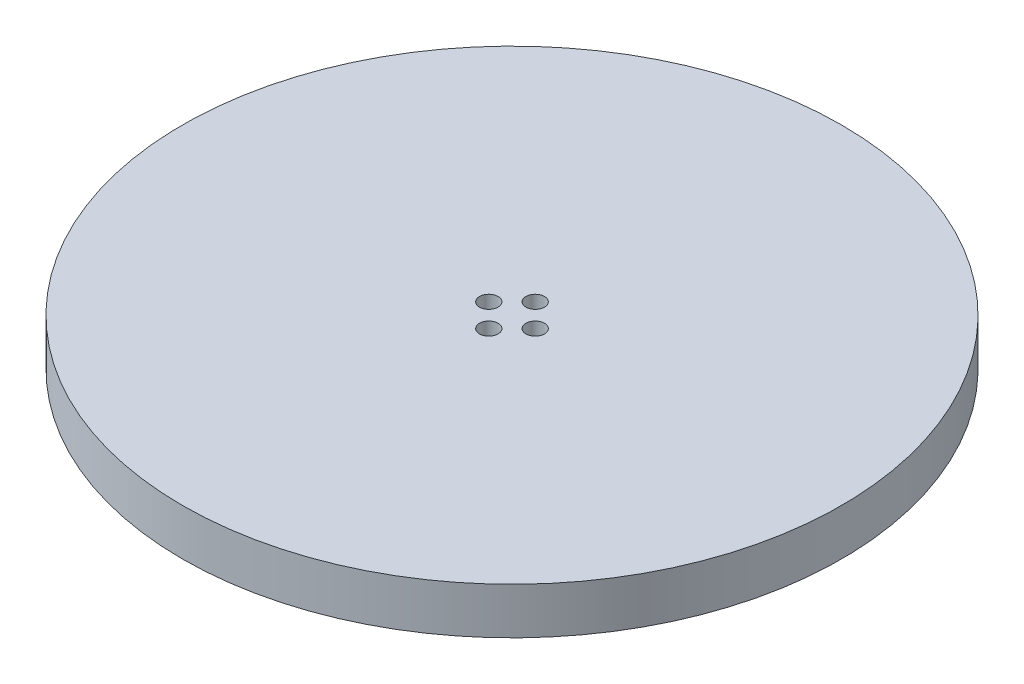
ISO-10303-21;
HEADER;
FILE_DESCRIPTION(('STEP AP214'),'2;1');
FILE_NAME('part.step','',(''),(''),'','','');
FILE_SCHEMA(('AUTOMOTIVE_DESIGN { 1 0 10303 214 1 1 1 1 }'));
ENDSEC;
DATA;
#1=APPLICATION_CONTEXT('core data for automotive mechanical design processes');
#2=APPLICATION_PROTOCOL_DEFINITION('international standard','automotive_design',2000,#1);
#3=PRODUCT_CONTEXT('',#1,'mechanical');
#4=PRODUCT('Part','Part','',(#3));
#5=PRODUCT_RELATED_PRODUCT_CATEGORY('part','',(#4));
#6=PRODUCT_DEFINITION_FORMATION('','',#4);
#7=PRODUCT_DEFINITION_CONTEXT('part definition',#1,'design');
#8=PRODUCT_DEFINITION('design','',#6,#7);
#9=PRODUCT_DEFINITION_SHAPE('','',#8);
#10=(LENGTH_UNIT() NAMED_UNIT(*) SI_UNIT(.MILLI.,.METRE.));
#11=(NAMED_UNIT(*) PLANE_ANGLE_UNIT() SI_UNIT($,.RADIAN.));
#12=(NAMED_UNIT(*) SI_UNIT($,.STERADIAN.) SOLID_ANGLE_UNIT());
#13=UNCERTAINTY_MEASURE_WITH_UNIT(LENGTH_MEASURE(1.E-05),#10,'distance_accuracy_value','');
#14=(GEOMETRIC_REPRESENTATION_CONTEXT(3) GLOBAL_UNCERTAINTY_ASSIGNED_CONTEXT((#13)) GLOBAL_UNIT_ASSIGNED_CONTEXT((#10,
#11,#12)) REPRESENTATION_CONTEXT('',''));
#15=CARTESIAN_POINT('',(0.,0.,0.));
#16=DIRECTION('',(0.,0.,1.));
#17=DIRECTION('',(1.,0.,0.));
#18=AXIS2_PLACEMENT_3D('',#15,#16,#17);
#19=CARTESIAN_POINT('',(-5.,10.,0.));
#20=DIRECTION('',(0.,-1.,0.));
#21=DIRECTION('',(0.,0.,-1.));
#22=AXIS2_PLACEMENT_3D('',#19,#20,#21);
#23=CYLINDRICAL_SURFACE('',#22,2.);
#24=CARTESIAN_POINT('',(-5.,10.,0.));
#25=DIRECTION('',(0.,1.,0.));
#26=DIRECTION('',(0.,0.,1.));
#27=AXIS2_PLACEMENT_3D('',#24,#25,#26);
#28=CIRCLE('',#27,2.);
#29=CARTESIAN_POINT('',(-5.,10.,2.));
#30=VERTEX_POINT('',#29);
#31=EDGE_CURVE('E41',#30,#30,#28,.T.);
#32=ORIENTED_EDGE('',*,*,#31,.T.);
#33=EDGE_LOOP('',(#32));
#34=FACE_BOUND('',#33,.T.);
#35=CARTESIAN_POINT('',(-5.,0.,0.));
#36=DIRECTION('',(0.,1.,0.));
#37=DIRECTION('',(0.,0.,1.));
#38=AXIS2_PLACEMENT_3D('',#35,#36,#37);
#39=CIRCLE('',#38,2.);
#40=CARTESIAN_POINT('',(-5.,0.,2.));
#41=VERTEX_POINT('',#40);
#42=EDGE_CURVE('E58',#41,#41,#39,.T.);
#43=ORIENTED_EDGE('',*,*,#42,.F.);
#44=EDGE_LOOP('',(#43));
#45=FACE_BOUND('',#44,.T.);
#46=ADVANCED_FACE('F33',(#34,#45),#23,.F.);
#47=CARTESIAN_POINT('',(0.,10.,0.));
#48=DIRECTION('',(0.,-1.,0.));
#49=DIRECTION('',(0.,0.,-1.));
#50=AXIS2_PLACEMENT_3D('',#47,#48,#49);
#51=CYLINDRICAL_SURFACE('',#50,71.);
#52=CARTESIAN_POINT('',(0.,10.,0.));
#53=DIRECTION('',(0.,1.,0.));
#54=DIRECTION('',(0.,0.,1.));
#55=AXIS2_PLACEMENT_3D('',#52,#53,#54);
#56=CIRCLE('',#55,71.);
#57=CARTESIAN_POINT('',(0.,10.,71.));
#58=VERTEX_POINT('',#57);
#59=EDGE_CURVE('E46',#58,#58,#56,.T.);
#60=ORIENTED_EDGE('',*,*,#59,.F.);
#61=EDGE_LOOP('',(#60));
#62=FACE_BOUND('',#61,.T.);
#63=CARTESIAN_POINT('',(0.,0.,0.));
#64=DIRECTION('',(0.,1.,0.));
#65=DIRECTION('',(0.,0.,1.));
#66=AXIS2_PLACEMENT_3D('',#63,#64,#65);
#67=CIRCLE('',#66,71.);
#68=CARTESIAN_POINT('',(0.,0.,71.));
#69=VERTEX_POINT('',#68);
#70=EDGE_CURVE('E56',#69,#69,#67,.T.);
#71=ORIENTED_EDGE('',*,*,#70,.T.);
#72=EDGE_LOOP('',(#71));
#73=FACE_BOUND('',#72,.T.);
#74=ADVANCED_FACE('F79',(#62,#73),#51,.T.);
#75=CARTESIAN_POINT('',(0.,10.,5.));
#76=DIRECTION('',(0.,-1.,0.));
#77=DIRECTION('',(0.,0.,-1.));
#78=AXIS2_PLACEMENT_3D('',#75,#76,#77);
#79=CYLINDRICAL_SURFACE('',#78,2.);
#80=CARTESIAN_POINT('',(0.,10.,5.));
#81=DIRECTION('',(0.,1.,0.));
#82=DIRECTION('',(0.,0.,1.));
#83=AXIS2_PLACEMENT_3D('',#80,#81,#82);
#84=CIRCLE('',#83,2.);
#85=CARTESIAN_POINT('',(0.,10.,7.));
#86=VERTEX_POINT('',#85);
#87=EDGE_CURVE('E67',#86,#86,#84,.T.);
#88=ORIENTED_EDGE('',*,*,#87,.T.);
#89=EDGE_LOOP('',(#88));
#90=FACE_BOUND('',#89,.T.);
#91=CARTESIAN_POINT('',(0.,0.,5.));
#92=DIRECTION('',(0.,1.,0.));
#93=DIRECTION('',(0.,0.,1.));
#94=AXIS2_PLACEMENT_3D('',#91,#92,#93);
#95=CIRCLE('',#94,2.);
#96=CARTESIAN_POINT('',(0.,0.,7.));
#97=VERTEX_POINT('',#96);
#98=EDGE_CURVE('E53',#97,#97,#95,.T.);
#99=ORIENTED_EDGE('',*,*,#98,.F.);
#100=EDGE_LOOP('',(#99));
#101=FACE_BOUND('',#100,.T.);
#102=ADVANCED_FACE('F82',(#90,#101),#79,.F.);
#103=CARTESIAN_POINT('',(0.,10.,-5.));
#104=DIRECTION('',(0.,-1.,0.));
#105=DIRECTION('',(0.,0.,-1.));
#106=AXIS2_PLACEMENT_3D('',#103,#104,#105);
#107=CYLINDRICAL_SURFACE('',#106,2.);
#108=CARTESIAN_POINT('',(0.,10.,-5.));
#109=DIRECTION('',(0.,1.,0.));
#110=DIRECTION('',(0.,0.,1.));
#111=AXIS2_PLACEMENT_3D('',#108,#109,#110);
#112=CIRCLE('',#111,2.);
#113=CARTESIAN_POINT('',(0.,10.,-3.));
#114=VERTEX_POINT('',#113);
#115=EDGE_CURVE('E63',#114,#114,#112,.T.);
#116=ORIENTED_EDGE('',*,*,#115,.T.);
#117=EDGE_LOOP('',(#116));
#118=FACE_BOUND('',#117,.T.);
#119=CARTESIAN_POINT('',(0.,0.,-5.));
#120=DIRECTION('',(0.,1.,0.));
#121=DIRECTION('',(0.,0.,1.));
#122=AXIS2_PLACEMENT_3D('',#119,#120,#121);
#123=CIRCLE('',#122,2.);
#124=CARTESIAN_POINT('',(0.,0.,-3.));
#125=VERTEX_POINT('',#124);
#126=EDGE_CURVE('E50',#125,#125,#123,.T.);
#127=ORIENTED_EDGE('',*,*,#126,.F.);
#128=EDGE_LOOP('',(#127));
#129=FACE_BOUND('',#128,.T.);
#130=ADVANCED_FACE('F35',(#118,#129),#107,.F.);
#131=CARTESIAN_POINT('',(5.,10.,0.));
#132=DIRECTION('',(0.,-1.,0.));
#133=DIRECTION('',(0.,0.,-1.));
#134=AXIS2_PLACEMENT_3D('',#131,#132,#133);
#135=CYLINDRICAL_SURFACE('',#134,2.);
#136=CARTESIAN_POINT('',(5.,10.,0.));
#137=DIRECTION('',(0.,1.,0.));
#138=DIRECTION('',(0.,0.,1.));
#139=AXIS2_PLACEMENT_3D('',#136,#137,#138);
#140=CIRCLE('',#139,2.);
#141=CARTESIAN_POINT('',(5.,10.,2.));
#142=VERTEX_POINT('',#141);
#143=EDGE_CURVE('E10',#142,#142,#140,.F.);
#144=ORIENTED_EDGE('',*,*,#143,.F.);
#145=EDGE_LOOP('',(#144));
#146=FACE_BOUND('',#145,.T.);
#147=CARTESIAN_POINT('',(5.,0.,0.));
#148=DIRECTION('',(0.,1.,0.));
#149=DIRECTION('',(0.,0.,1.));
#150=AXIS2_PLACEMENT_3D('',#147,#148,#149);
#151=CIRCLE('',#150,2.);
#152=CARTESIAN_POINT('',(5.,0.,2.));
#153=VERTEX_POINT('',#152);
#154=EDGE_CURVE('E37',#153,#153,#151,.F.);
#155=ORIENTED_EDGE('',*,*,#154,.T.);
#156=EDGE_LOOP('',(#155));
#157=FACE_BOUND('',#156,.T.);
#158=ADVANCED_FACE('F94',(#146,#157),#135,.F.);
#159=CARTESIAN_POINT('',(0.,10.,0.));
#160=DIRECTION('',(0.,1.,0.));
#161=DIRECTION('',(0.,0.,1.));
#162=AXIS2_PLACEMENT_3D('',#159,#160,#161);
#163=PLANE('',#162);
#164=ORIENTED_EDGE('',*,*,#115,.F.);
#165=EDGE_LOOP('',(#164));
#166=FACE_BOUND('',#165,.T.);
#167=ORIENTED_EDGE('',*,*,#87,.F.);
#168=EDGE_LOOP('',(#167));
#169=FACE_BOUND('',#168,.T.);
#170=ORIENTED_EDGE('',*,*,#59,.T.);
#171=EDGE_LOOP('',(#170));
#172=FACE_BOUND('',#171,.T.);
#173=ORIENTED_EDGE('',*,*,#31,.F.);
#174=EDGE_LOOP('',(#173));
#175=FACE_BOUND('',#174,.T.);
#176=ORIENTED_EDGE('',*,*,#143,.T.);
#177=EDGE_LOOP('',(#176));
#178=FACE_BOUND('',#177,.T.);
#179=ADVANCED_FACE('F76',(#166,#169,#172,#175,#178),#163,.T.);
#180=CARTESIAN_POINT('',(0.,0.,0.));
#181=DIRECTION('',(0.,1.,0.));
#182=DIRECTION('',(0.,0.,1.));
#183=AXIS2_PLACEMENT_3D('',#180,#181,#182);
#184=PLANE('',#183);
#185=ORIENTED_EDGE('',*,*,#126,.T.);
#186=EDGE_LOOP('',(#185));
#187=FACE_BOUND('',#186,.T.);
#188=ORIENTED_EDGE('',*,*,#98,.T.);
#189=EDGE_LOOP('',(#188));
#190=FACE_BOUND('',#189,.T.);
#191=ORIENTED_EDGE('',*,*,#70,.F.);
#192=EDGE_LOOP('',(#191));
#193=FACE_BOUND('',#192,.T.);
#194=ORIENTED_EDGE('',*,*,#42,.T.);
#195=EDGE_LOOP('',(#194));
#196=FACE_BOUND('',#195,.T.);
#197=ORIENTED_EDGE('',*,*,#154,.F.);
#198=EDGE_LOOP('',(#197));
#199=FACE_BOUND('',#198,.T.);
#200=ADVANCED_FACE('F86',(#187,#190,#193,#196,#199),#184,.F.);
#201=CLOSED_SHELL('',(#46,#74,#102,#130,#158,#179,#200));
#202=MANIFOLD_SOLID_BREP('B2',#201);
#203=ADVANCED_BREP_SHAPE_REPRESENTATION('',(#18,#202),#14);
#204=SHAPE_DEFINITION_REPRESENTATION(#9,#203);
ENDSEC;
END-ISO-10303-21;
